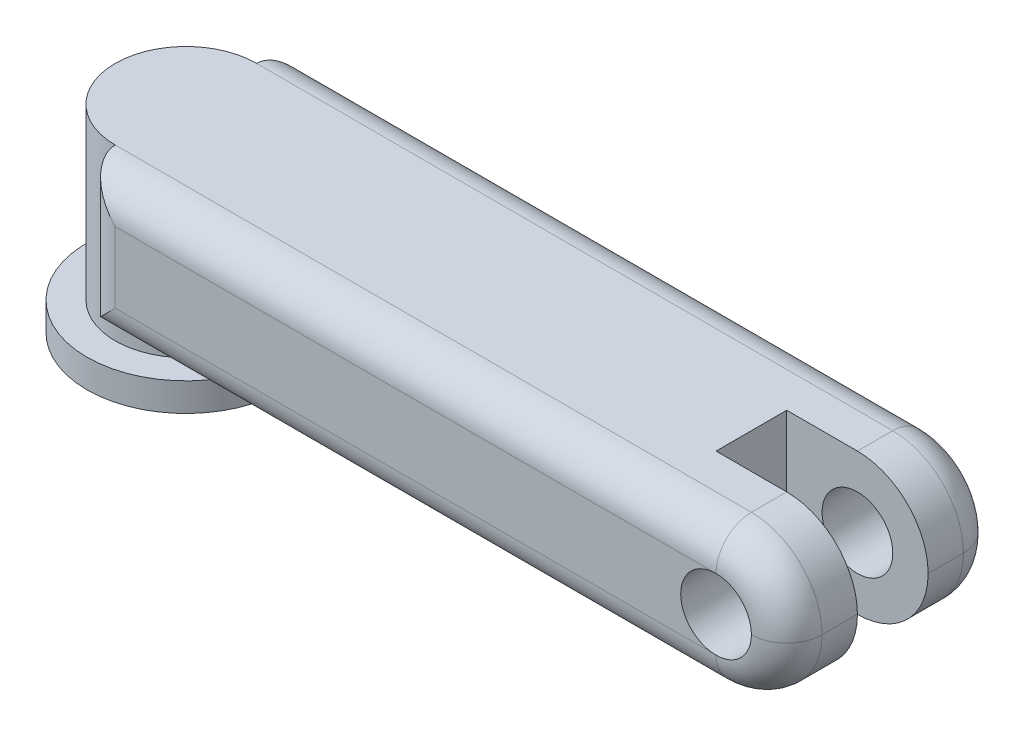
ISO-10303-21;
HEADER;
FILE_DESCRIPTION(('STEP AP214'),'2;1');
FILE_NAME('part.step','',(''),(''),'','','');
FILE_SCHEMA(('AUTOMOTIVE_DESIGN { 1 0 10303 214 1 1 1 1 }'));
ENDSEC;
DATA;
#1=APPLICATION_CONTEXT('core data for automotive mechanical design processes');
#2=APPLICATION_PROTOCOL_DEFINITION('international standard','automotive_design',2000,#1);
#3=PRODUCT_CONTEXT('',#1,'mechanical');
#4=PRODUCT('Part','Part','',(#3));
#5=PRODUCT_RELATED_PRODUCT_CATEGORY('part','',(#4));
#6=PRODUCT_DEFINITION_FORMATION('','',#4);
#7=PRODUCT_DEFINITION_CONTEXT('part definition',#1,'design');
#8=PRODUCT_DEFINITION('design','',#6,#7);
#9=PRODUCT_DEFINITION_SHAPE('','',#8);
#10=(LENGTH_UNIT() NAMED_UNIT(*) SI_UNIT(.MILLI.,.METRE.));
#11=(NAMED_UNIT(*) PLANE_ANGLE_UNIT() SI_UNIT($,.RADIAN.));
#12=(NAMED_UNIT(*) SI_UNIT($,.STERADIAN.) SOLID_ANGLE_UNIT());
#13=UNCERTAINTY_MEASURE_WITH_UNIT(LENGTH_MEASURE(1.E-05),#10,'distance_accuracy_value','');
#14=(GEOMETRIC_REPRESENTATION_CONTEXT(3) GLOBAL_UNCERTAINTY_ASSIGNED_CONTEXT((#13)) GLOBAL_UNIT_ASSIGNED_CONTEXT((#10,
#11,#12)) REPRESENTATION_CONTEXT('',''));
#15=CARTESIAN_POINT('',(0.,0.,0.));
#16=DIRECTION('',(0.,0.,1.));
#17=DIRECTION('',(1.,0.,0.));
#18=AXIS2_PLACEMENT_3D('',#15,#16,#17);
#19=CARTESIAN_POINT('',(40.,10.,-2.5));
#20=DIRECTION('',(0.,0.,1.));
#21=DIRECTION('',(1.,0.,0.));
#22=AXIS2_PLACEMENT_3D('',#19,#20,#21);
#23=PLANE('',#22);
#24=DIRECTION('',(-1.,0.,0.));
#25=VECTOR('',#24,1.);
#26=CARTESIAN_POINT('',(40.,0.,-2.5));
#27=LINE('',#26,#25);
#28=CARTESIAN_POINT('',(45.,0.,-2.5));
#29=VERTEX_POINT('',#28);
#30=CARTESIAN_POINT('',(40.,0.,-2.5));
#31=VERTEX_POINT('',#30);
#32=EDGE_CURVE('E286',#29,#31,#27,.T.);
#33=ORIENTED_EDGE('',*,*,#32,.F.);
#34=CARTESIAN_POINT('',(45.,5.,-2.5));
#35=DIRECTION('',(0.,0.,1.));
#36=DIRECTION('',(1.,0.,0.));
#37=AXIS2_PLACEMENT_3D('',#34,#35,#36);
#38=CIRCLE('',#37,5.);
#39=CARTESIAN_POINT('',(50.,5.,-2.5));
#40=VERTEX_POINT('',#39);
#41=EDGE_CURVE('E247',#29,#40,#38,.T.);
#42=ORIENTED_EDGE('',*,*,#41,.T.);
#43=CARTESIAN_POINT('',(45.,5.,-2.5));
#44=DIRECTION('',(0.,0.,1.));
#45=DIRECTION('',(1.,0.,0.));
#46=AXIS2_PLACEMENT_3D('',#43,#44,#45);
#47=CIRCLE('',#46,5.);
#48=CARTESIAN_POINT('',(45.,10.,-2.5));
#49=VERTEX_POINT('',#48);
#50=EDGE_CURVE('E240',#40,#49,#47,.T.);
#51=ORIENTED_EDGE('',*,*,#50,.T.);
#52=DIRECTION('',(-1.,0.,0.));
#53=VECTOR('',#52,1.);
#54=CARTESIAN_POINT('',(40.,10.,-2.5));
#55=LINE('',#54,#53);
#56=CARTESIAN_POINT('',(40.,10.,-2.5));
#57=VERTEX_POINT('',#56);
#58=EDGE_CURVE('E290',#49,#57,#55,.T.);
#59=ORIENTED_EDGE('',*,*,#58,.T.);
#60=DIRECTION('',(0.,-1.,0.));
#61=VECTOR('',#60,1.);
#62=CARTESIAN_POINT('',(40.,10.,-2.5));
#63=LINE('',#62,#61);
#64=EDGE_CURVE('E299',#57,#31,#63,.T.);
#65=ORIENTED_EDGE('',*,*,#64,.T.);
#66=EDGE_LOOP('',(#33,#42,#51,#59,#65));
#67=FACE_BOUND('',#66,.T.);
#68=CARTESIAN_POINT('',(45.,5.,-2.5));
#69=DIRECTION('',(0.,0.,-1.));
#70=DIRECTION('',(-1.,0.,0.));
#71=AXIS2_PLACEMENT_3D('',#68,#69,#70);
#72=CIRCLE('',#71,2.5);
#73=CARTESIAN_POINT('',(42.5,5.,-2.5));
#74=VERTEX_POINT('',#73);
#75=EDGE_CURVE('E294',#74,#74,#72,.T.);
#76=ORIENTED_EDGE('',*,*,#75,.T.);
#77=EDGE_LOOP('',(#76));
#78=FACE_BOUND('',#77,.T.);
#79=ADVANCED_FACE('F36',(#67,#78),#23,.T.);
#80=CARTESIAN_POINT('',(0.,10.,-7.5));
#81=DIRECTION('',(0.,0.,-1.));
#82=DIRECTION('',(-1.,0.,0.));
#83=AXIS2_PLACEMENT_3D('',#80,#81,#82);
#84=PLANE('',#83);
#85=DIRECTION('',(0.,-1.,0.));
#86=VECTOR('',#85,1.);
#87=CARTESIAN_POINT('',(2.5,10.,-7.5));
#88=LINE('',#87,#86);
#89=CARTESIAN_POINT('',(2.5,2.5,-7.5));
#90=VERTEX_POINT('',#89);
#91=CARTESIAN_POINT('',(2.5,7.5,-7.5));
#92=VERTEX_POINT('',#91);
#93=EDGE_CURVE('E188',#90,#92,#88,.F.);
#94=ORIENTED_EDGE('',*,*,#93,.T.);
#95=DIRECTION('',(1.,0.,0.));
#96=VECTOR('',#95,1.);
#97=CARTESIAN_POINT('',(0.,7.5,-7.5));
#98=LINE('',#97,#96);
#99=CARTESIAN_POINT('',(45.,7.5,-7.5));
#100=VERTEX_POINT('',#99);
#101=EDGE_CURVE('E183',#92,#100,#98,.T.);
#102=ORIENTED_EDGE('',*,*,#101,.T.);
#103=CARTESIAN_POINT('',(45.,5.,-7.5));
#104=DIRECTION('',(0.,0.,-1.));
#105=DIRECTION('',(-1.,0.,0.));
#106=AXIS2_PLACEMENT_3D('',#103,#104,#105);
#107=CIRCLE('',#106,2.5);
#108=CARTESIAN_POINT('',(45.,2.5,-7.5));
#109=VERTEX_POINT('',#108);
#110=EDGE_CURVE('E289',#109,#100,#107,.T.);
#111=ORIENTED_EDGE('',*,*,#110,.F.);
#112=DIRECTION('',(1.,0.,0.));
#113=VECTOR('',#112,1.);
#114=CARTESIAN_POINT('',(0.,2.5,-7.5));
#115=LINE('',#114,#113);
#116=EDGE_CURVE('E258',#109,#90,#115,.F.);
#117=ORIENTED_EDGE('',*,*,#116,.T.);
#118=EDGE_LOOP('',(#94,#102,#111,#117));
#119=FACE_BOUND('',#118,.T.);
#120=ADVANCED_FACE('F266',(#119),#84,.T.);
#121=CARTESIAN_POINT('',(0.,10.,7.5));
#122=DIRECTION('',(0.,0.,-1.));
#123=DIRECTION('',(-1.,0.,0.));
#124=AXIS2_PLACEMENT_3D('',#121,#122,#123);
#125=PLANE('',#124);
#126=CARTESIAN_POINT('',(45.,5.,7.5));
#127=DIRECTION('',(0.,0.,-1.));
#128=DIRECTION('',(-1.,0.,0.));
#129=AXIS2_PLACEMENT_3D('',#126,#127,#128);
#130=CIRCLE('',#129,2.5);
#131=CARTESIAN_POINT('',(45.,2.5,7.5));
#132=VERTEX_POINT('',#131);
#133=CARTESIAN_POINT('',(45.,7.5,7.5));
#134=VERTEX_POINT('',#133);
#135=EDGE_CURVE('E307',#132,#134,#130,.T.);
#136=ORIENTED_EDGE('',*,*,#135,.T.);
#137=DIRECTION('',(1.,0.,0.));
#138=VECTOR('',#137,1.);
#139=CARTESIAN_POINT('',(0.,7.5,7.5));
#140=LINE('',#139,#138);
#141=CARTESIAN_POINT('',(2.5,7.5,7.5));
#142=VERTEX_POINT('',#141);
#143=EDGE_CURVE('E198',#134,#142,#140,.F.);
#144=ORIENTED_EDGE('',*,*,#143,.T.);
#145=DIRECTION('',(0.,-1.,0.));
#146=VECTOR('',#145,1.);
#147=CARTESIAN_POINT('',(2.5,10.,7.5));
#148=LINE('',#147,#146);
#149=CARTESIAN_POINT('',(2.5,2.5,7.5));
#150=VERTEX_POINT('',#149);
#151=EDGE_CURVE('E174',#142,#150,#148,.T.);
#152=ORIENTED_EDGE('',*,*,#151,.T.);
#153=DIRECTION('',(1.,0.,0.));
#154=VECTOR('',#153,1.);
#155=CARTESIAN_POINT('',(0.,2.5,7.5));
#156=LINE('',#155,#154);
#157=EDGE_CURVE('E195',#150,#132,#156,.T.);
#158=ORIENTED_EDGE('',*,*,#157,.T.);
#159=EDGE_LOOP('',(#136,#144,#152,#158));
#160=FACE_BOUND('',#159,.T.);
#161=ADVANCED_FACE('F357',(#160),#125,.F.);
#162=CARTESIAN_POINT('',(40.,10.,2.5));
#163=DIRECTION('',(0.,0.,1.));
#164=DIRECTION('',(1.,0.,0.));
#165=AXIS2_PLACEMENT_3D('',#162,#163,#164);
#166=PLANE('',#165);
#167=CARTESIAN_POINT('',(45.,5.,2.5));
#168=DIRECTION('',(0.,0.,-1.));
#169=DIRECTION('',(-1.,0.,0.));
#170=AXIS2_PLACEMENT_3D('',#167,#168,#169);
#171=CIRCLE('',#170,2.5);
#172=CARTESIAN_POINT('',(42.5,5.,2.5));
#173=VERTEX_POINT('',#172);
#174=EDGE_CURVE('E303',#173,#173,#171,.T.);
#175=ORIENTED_EDGE('',*,*,#174,.F.);
#176=EDGE_LOOP('',(#175));
#177=FACE_BOUND('',#176,.T.);
#178=CARTESIAN_POINT('',(45.,5.,2.5));
#179=DIRECTION('',(0.,0.,1.));
#180=DIRECTION('',(1.,0.,0.));
#181=AXIS2_PLACEMENT_3D('',#178,#179,#180);
#182=CIRCLE('',#181,5.);
#183=CARTESIAN_POINT('',(45.,10.,2.5));
#184=VERTEX_POINT('',#183);
#185=CARTESIAN_POINT('',(50.,5.,2.5));
#186=VERTEX_POINT('',#185);
#187=EDGE_CURVE('E254',#184,#186,#182,.F.);
#188=ORIENTED_EDGE('',*,*,#187,.T.);
#189=CARTESIAN_POINT('',(45.,5.,2.5));
#190=DIRECTION('',(0.,0.,1.));
#191=DIRECTION('',(1.,0.,0.));
#192=AXIS2_PLACEMENT_3D('',#189,#190,#191);
#193=CIRCLE('',#192,5.);
#194=CARTESIAN_POINT('',(45.,0.,2.5));
#195=VERTEX_POINT('',#194);
#196=EDGE_CURVE('E256',#186,#195,#193,.F.);
#197=ORIENTED_EDGE('',*,*,#196,.T.);
#198=DIRECTION('',(-1.,0.,0.));
#199=VECTOR('',#198,1.);
#200=CARTESIAN_POINT('',(40.,0.,2.5));
#201=LINE('',#200,#199);
#202=CARTESIAN_POINT('',(40.,0.,2.5));
#203=VERTEX_POINT('',#202);
#204=EDGE_CURVE('E236',#195,#203,#201,.T.);
#205=ORIENTED_EDGE('',*,*,#204,.T.);
#206=DIRECTION('',(0.,-1.,0.));
#207=VECTOR('',#206,1.);
#208=CARTESIAN_POINT('',(40.,10.,2.5));
#209=LINE('',#208,#207);
#210=CARTESIAN_POINT('',(40.,10.,2.5));
#211=VERTEX_POINT('',#210);
#212=EDGE_CURVE('E242',#211,#203,#209,.T.);
#213=ORIENTED_EDGE('',*,*,#212,.F.);
#214=DIRECTION('',(-1.,0.,0.));
#215=VECTOR('',#214,1.);
#216=CARTESIAN_POINT('',(40.,10.,2.5));
#217=LINE('',#216,#215);
#218=EDGE_CURVE('E310',#184,#211,#217,.T.);
#219=ORIENTED_EDGE('',*,*,#218,.F.);
#220=EDGE_LOOP('',(#188,#197,#205,#213,#219));
#221=FACE_BOUND('',#220,.T.);
#222=ADVANCED_FACE('F334',(#177,#221),#166,.F.);
#223=CARTESIAN_POINT('',(40.,10.,0.));
#224=DIRECTION('',(-1.,0.,0.));
#225=DIRECTION('',(0.,0.,1.));
#226=AXIS2_PLACEMENT_3D('',#223,#224,#225);
#227=PLANE('',#226);
#228=DIRECTION('',(0.,0.,-1.));
#229=VECTOR('',#228,1.);
#230=CARTESIAN_POINT('',(40.,0.,0.));
#231=LINE('',#230,#229);
#232=EDGE_CURVE('E313',#203,#31,#231,.T.);
#233=ORIENTED_EDGE('',*,*,#232,.T.);
#234=ORIENTED_EDGE('',*,*,#64,.F.);
#235=DIRECTION('',(0.,0.,-1.));
#236=VECTOR('',#235,1.);
#237=CARTESIAN_POINT('',(40.,10.,0.));
#238=LINE('',#237,#236);
#239=EDGE_CURVE('E312',#211,#57,#238,.T.);
#240=ORIENTED_EDGE('',*,*,#239,.F.);
#241=ORIENTED_EDGE('',*,*,#212,.T.);
#242=EDGE_LOOP('',(#233,#234,#240,#241));
#243=FACE_BOUND('',#242,.T.);
#244=ADVANCED_FACE('F322',(#243),#227,.F.);
#245=CARTESIAN_POINT('',(0.,10.,0.));
#246=DIRECTION('',(0.,1.,0.));
#247=DIRECTION('',(0.,0.,1.));
#248=AXIS2_PLACEMENT_3D('',#245,#246,#247);
#249=PLANE('',#248);
#250=DIRECTION('',(0.,0.,1.));
#251=VECTOR('',#250,1.);
#252=CARTESIAN_POINT('',(45.,10.,0.));
#253=LINE('',#252,#251);
#254=CARTESIAN_POINT('',(45.,10.,-5.));
#255=VERTEX_POINT('',#254);
#256=EDGE_CURVE('E252',#49,#255,#253,.F.);
#257=ORIENTED_EDGE('',*,*,#256,.T.);
#258=DIRECTION('',(1.,0.,0.));
#259=VECTOR('',#258,1.);
#260=CARTESIAN_POINT('',(0.,10.,-5.));
#261=LINE('',#260,#259);
#262=CARTESIAN_POINT('',(0.,10.,-5.));
#263=VERTEX_POINT('',#262);
#264=EDGE_CURVE('E168',#255,#263,#261,.F.);
#265=ORIENTED_EDGE('',*,*,#264,.T.);
#266=CARTESIAN_POINT('',(0.,10.,0.));
#267=DIRECTION('',(0.,1.,0.));
#268=DIRECTION('',(0.,0.,1.));
#269=AXIS2_PLACEMENT_3D('',#266,#267,#268);
#270=CIRCLE('',#269,5.);
#271=CARTESIAN_POINT('',(0.,10.,5.));
#272=VERTEX_POINT('',#271);
#273=EDGE_CURVE('E151',#263,#272,#270,.T.);
#274=ORIENTED_EDGE('',*,*,#273,.T.);
#275=DIRECTION('',(1.,0.,0.));
#276=VECTOR('',#275,1.);
#277=CARTESIAN_POINT('',(45.,10.,5.));
#278=LINE('',#277,#276);
#279=CARTESIAN_POINT('',(45.,10.,5.));
#280=VERTEX_POINT('',#279);
#281=EDGE_CURVE('E166',#272,#280,#278,.T.);
#282=ORIENTED_EDGE('',*,*,#281,.T.);
#283=DIRECTION('',(0.,0.,-1.));
#284=VECTOR('',#283,1.);
#285=CARTESIAN_POINT('',(45.,10.,2.5));
#286=LINE('',#285,#284);
#287=EDGE_CURVE('E250',#280,#184,#286,.T.);
#288=ORIENTED_EDGE('',*,*,#287,.T.);
#289=ORIENTED_EDGE('',*,*,#218,.T.);
#290=ORIENTED_EDGE('',*,*,#239,.T.);
#291=ORIENTED_EDGE('',*,*,#58,.F.);
#292=EDGE_LOOP('',(#257,#265,#274,#282,#288,#289,#290,#291));
#293=FACE_BOUND('',#292,.T.);
#294=ADVANCED_FACE('F164',(#293),#249,.T.);
#295=CARTESIAN_POINT('',(0.,0.,0.));
#296=DIRECTION('',(0.,1.,0.));
#297=DIRECTION('',(0.,0.,1.));
#298=AXIS2_PLACEMENT_3D('',#295,#296,#297);
#299=PLANE('',#298);
#300=CARTESIAN_POINT('',(0.,0.,0.));
#301=DIRECTION('',(0.,1.,0.));
#302=DIRECTION('',(0.,0.,1.));
#303=AXIS2_PLACEMENT_3D('',#300,#301,#302);
#304=CIRCLE('',#303,5.);
#305=CARTESIAN_POINT('',(0.,0.,5.));
#306=VERTEX_POINT('',#305);
#307=CARTESIAN_POINT('',(0.,0.,-5.));
#308=VERTEX_POINT('',#307);
#309=EDGE_CURVE('E153',#306,#308,#304,.T.);
#310=ORIENTED_EDGE('',*,*,#309,.T.);
#311=DIRECTION('',(1.,0.,0.));
#312=VECTOR('',#311,1.);
#313=CARTESIAN_POINT('',(45.,0.,-5.));
#314=LINE('',#313,#312);
#315=CARTESIAN_POINT('',(45.,0.,-5.));
#316=VERTEX_POINT('',#315);
#317=EDGE_CURVE('E11',#308,#316,#314,.T.);
#318=ORIENTED_EDGE('',*,*,#317,.T.);
#319=DIRECTION('',(0.,0.,1.));
#320=VECTOR('',#319,1.);
#321=CARTESIAN_POINT('',(45.,0.,-2.5));
#322=LINE('',#321,#320);
#323=EDGE_CURVE('E238',#316,#29,#322,.T.);
#324=ORIENTED_EDGE('',*,*,#323,.T.);
#325=ORIENTED_EDGE('',*,*,#32,.T.);
#326=ORIENTED_EDGE('',*,*,#232,.F.);
#327=ORIENTED_EDGE('',*,*,#204,.F.);
#328=DIRECTION('',(0.,0.,-1.));
#329=VECTOR('',#328,1.);
#330=CARTESIAN_POINT('',(45.,0.,0.));
#331=LINE('',#330,#329);
#332=CARTESIAN_POINT('',(45.,0.,5.));
#333=VERTEX_POINT('',#332);
#334=EDGE_CURVE('E234',#195,#333,#331,.F.);
#335=ORIENTED_EDGE('',*,*,#334,.T.);
#336=DIRECTION('',(1.,0.,0.));
#337=VECTOR('',#336,1.);
#338=CARTESIAN_POINT('',(0.,0.,5.));
#339=LINE('',#338,#337);
#340=EDGE_CURVE('E45',#333,#306,#339,.F.);
#341=ORIENTED_EDGE('',*,*,#340,.T.);
#342=EDGE_LOOP('',(#310,#318,#324,#325,#326,#327,#335,#341));
#343=FACE_BOUND('',#342,.T.);
#344=ADVANCED_FACE('F231',(#343),#299,.F.);
#345=CARTESIAN_POINT('',(45.,5.,7.5));
#346=DIRECTION('',(0.,0.,-1.));
#347=DIRECTION('',(-1.,0.,0.));
#348=AXIS2_PLACEMENT_3D('',#345,#346,#347);
#349=CYLINDRICAL_SURFACE('',#348,2.5);
#350=CARTESIAN_POINT('',(47.5,5.,7.5));
#351=VERTEX_POINT('',#350);
#352=EDGE_CURVE('E304',#134,#351,#130,.T.);
#353=ORIENTED_EDGE('',*,*,#352,.F.);
#354=ORIENTED_EDGE('',*,*,#135,.F.);
#355=EDGE_CURVE('E226',#351,#132,#130,.T.);
#356=ORIENTED_EDGE('',*,*,#355,.F.);
#357=EDGE_LOOP('',(#353,#354,#356));
#358=FACE_BOUND('',#357,.T.);
#359=ORIENTED_EDGE('',*,*,#174,.T.);
#360=EDGE_LOOP('',(#359));
#361=FACE_BOUND('',#360,.T.);
#362=ADVANCED_FACE('F361',(#358,#361),#349,.F.);
#363=CARTESIAN_POINT('',(45.,5.,-7.5));
#364=DIRECTION('',(0.,0.,1.));
#365=DIRECTION('',(1.,0.,0.));
#366=AXIS2_PLACEMENT_3D('',#363,#364,#365);
#367=CYLINDRICAL_SURFACE('',#366,2.5);
#368=CARTESIAN_POINT('',(47.5,5.,-7.5));
#369=VERTEX_POINT('',#368);
#370=EDGE_CURVE('E280',#100,#369,#107,.T.);
#371=ORIENTED_EDGE('',*,*,#370,.T.);
#372=EDGE_CURVE('E287',#369,#109,#107,.T.);
#373=ORIENTED_EDGE('',*,*,#372,.T.);
#374=ORIENTED_EDGE('',*,*,#110,.T.);
#375=EDGE_LOOP('',(#371,#373,#374));
#376=FACE_BOUND('',#375,.T.);
#377=ORIENTED_EDGE('',*,*,#75,.F.);
#378=EDGE_LOOP('',(#377));
#379=FACE_BOUND('',#378,.T.);
#380=ADVANCED_FACE('F364',(#376,#379),#367,.F.);
#381=CARTESIAN_POINT('',(0.,-2.,0.));
#382=DIRECTION('',(0.,1.,0.));
#383=DIRECTION('',(0.,0.,1.));
#384=AXIS2_PLACEMENT_3D('',#381,#382,#383);
#385=CYLINDRICAL_SURFACE('',#384,5.);
#386=CARTESIAN_POINT('',(0.,-2.,0.));
#387=DIRECTION('',(0.,-1.,0.));
#388=DIRECTION('',(0.,0.,-1.));
#389=AXIS2_PLACEMENT_3D('',#386,#387,#388);
#390=CIRCLE('',#389,5.);
#391=CARTESIAN_POINT('',(0.,-2.,-5.));
#392=VERTEX_POINT('',#391);
#393=EDGE_CURVE('E169',#392,#392,#390,.F.);
#394=ORIENTED_EDGE('',*,*,#393,.T.);
#395=EDGE_LOOP('',(#394));
#396=FACE_BOUND('',#395,.T.);
#397=DIRECTION('',(0.,1.,0.));
#398=VECTOR('',#397,1.);
#399=CARTESIAN_POINT('',(0.,-2.,-5.));
#400=LINE('',#399,#398);
#401=EDGE_CURVE('E158',#308,#263,#400,.T.);
#402=ORIENTED_EDGE('',*,*,#401,.F.);
#403=ORIENTED_EDGE('',*,*,#309,.F.);
#404=DIRECTION('',(0.,1.,0.));
#405=VECTOR('',#404,1.);
#406=CARTESIAN_POINT('',(0.,-2.,5.));
#407=LINE('',#406,#405);
#408=EDGE_CURVE('E148',#272,#306,#407,.F.);
#409=ORIENTED_EDGE('',*,*,#408,.F.);
#410=ORIENTED_EDGE('',*,*,#273,.F.);
#411=EDGE_LOOP('',(#402,#403,#409,#410));
#412=FACE_BOUND('',#411,.T.);
#413=ADVANCED_FACE('F150',(#396,#412),#385,.T.);
#414=CARTESIAN_POINT('',(0.,-4.,0.));
#415=DIRECTION('',(0.,1.,0.));
#416=DIRECTION('',(0.,0.,1.));
#417=AXIS2_PLACEMENT_3D('',#414,#415,#416);
#418=CYLINDRICAL_SURFACE('',#417,7.);
#419=CARTESIAN_POINT('',(0.,-4.,0.));
#420=DIRECTION('',(0.,-1.,0.));
#421=DIRECTION('',(0.,0.,-1.));
#422=AXIS2_PLACEMENT_3D('',#419,#420,#421);
#423=CIRCLE('',#422,7.);
#424=CARTESIAN_POINT('',(0.,-4.,-7.));
#425=VERTEX_POINT('',#424);
#426=EDGE_CURVE('E411',#425,#425,#423,.T.);
#427=ORIENTED_EDGE('',*,*,#426,.F.);
#428=EDGE_LOOP('',(#427));
#429=FACE_BOUND('',#428,.T.);
#430=CARTESIAN_POINT('',(0.,-2.,0.));
#431=DIRECTION('',(0.,-1.,0.));
#432=DIRECTION('',(0.,0.,-1.));
#433=AXIS2_PLACEMENT_3D('',#430,#431,#432);
#434=CIRCLE('',#433,7.);
#435=CARTESIAN_POINT('',(0.,-2.,-7.));
#436=VERTEX_POINT('',#435);
#437=EDGE_CURVE('E261',#436,#436,#434,.T.);
#438=ORIENTED_EDGE('',*,*,#437,.T.);
#439=EDGE_LOOP('',(#438));
#440=FACE_BOUND('',#439,.T.);
#441=ADVANCED_FACE('F398',(#429,#440),#418,.T.);
#442=CARTESIAN_POINT('',(0.,-4.,0.));
#443=DIRECTION('',(0.,-1.,0.));
#444=DIRECTION('',(0.,0.,-1.));
#445=AXIS2_PLACEMENT_3D('',#442,#443,#444);
#446=PLANE('',#445);
#447=ORIENTED_EDGE('',*,*,#426,.T.);
#448=EDGE_LOOP('',(#447));
#449=FACE_BOUND('',#448,.T.);
#450=ADVANCED_FACE('F386',(#449),#446,.T.);
#451=CARTESIAN_POINT('',(0.,-2.,0.));
#452=DIRECTION('',(0.,-1.,0.));
#453=DIRECTION('',(0.,0.,-1.));
#454=AXIS2_PLACEMENT_3D('',#451,#452,#453);
#455=PLANE('',#454);
#456=ORIENTED_EDGE('',*,*,#393,.F.);
#457=EDGE_LOOP('',(#456));
#458=FACE_BOUND('',#457,.T.);
#459=ORIENTED_EDGE('',*,*,#437,.F.);
#460=EDGE_LOOP('',(#459));
#461=FACE_BOUND('',#460,.T.);
#462=ADVANCED_FACE('F381',(#458,#461),#455,.F.);
#463=CARTESIAN_POINT('',(45.,5.,-7.5));
#464=DIRECTION('',(0.,0.,1.));
#465=DIRECTION('',(1.,0.,0.));
#466=AXIS2_PLACEMENT_3D('',#463,#464,#465);
#467=CYLINDRICAL_SURFACE('',#466,5.);
#468=DIRECTION('',(0.,0.,1.));
#469=VECTOR('',#468,1.);
#470=CARTESIAN_POINT('',(50.,5.,-7.5));
#471=LINE('',#470,#469);
#472=CARTESIAN_POINT('',(50.,5.,-5.));
#473=VERTEX_POINT('',#472);
#474=EDGE_CURVE('E259',#473,#40,#471,.T.);
#475=ORIENTED_EDGE('',*,*,#474,.F.);
#476=CARTESIAN_POINT('',(45.,5.,-5.));
#477=DIRECTION('',(0.,0.,-1.));
#478=DIRECTION('',(-1.,0.,0.));
#479=AXIS2_PLACEMENT_3D('',#476,#477,#478);
#480=CIRCLE('',#479,5.);
#481=EDGE_CURVE('E185',#473,#255,#480,.F.);
#482=ORIENTED_EDGE('',*,*,#481,.T.);
#483=ORIENTED_EDGE('',*,*,#256,.F.);
#484=ORIENTED_EDGE('',*,*,#50,.F.);
#485=EDGE_LOOP('',(#475,#482,#483,#484));
#486=FACE_BOUND('',#485,.T.);
#487=ADVANCED_FACE('F378',(#486),#467,.T.);
#488=CARTESIAN_POINT('',(45.,5.,0.));
#489=DIRECTION('',(0.,0.,-1.));
#490=DIRECTION('',(-1.,0.,0.));
#491=AXIS2_PLACEMENT_3D('',#488,#489,#490);
#492=CYLINDRICAL_SURFACE('',#491,5.);
#493=ORIENTED_EDGE('',*,*,#323,.F.);
#494=CARTESIAN_POINT('',(45.,5.,-5.));
#495=DIRECTION('',(0.,0.,-1.));
#496=DIRECTION('',(-1.,0.,0.));
#497=AXIS2_PLACEMENT_3D('',#494,#495,#496);
#498=CIRCLE('',#497,5.);
#499=EDGE_CURVE('E193',#316,#473,#498,.F.);
#500=ORIENTED_EDGE('',*,*,#499,.T.);
#501=ORIENTED_EDGE('',*,*,#474,.T.);
#502=ORIENTED_EDGE('',*,*,#41,.F.);
#503=EDGE_LOOP('',(#493,#500,#501,#502));
#504=FACE_BOUND('',#503,.T.);
#505=ADVANCED_FACE('F347',(#504),#492,.T.);
#506=CARTESIAN_POINT('',(45.,5.,0.));
#507=DIRECTION('',(0.,0.,1.));
#508=DIRECTION('',(1.,0.,0.));
#509=AXIS2_PLACEMENT_3D('',#506,#507,#508);
#510=CYLINDRICAL_SURFACE('',#509,5.);
#511=ORIENTED_EDGE('',*,*,#287,.F.);
#512=CARTESIAN_POINT('',(45.,5.,5.));
#513=DIRECTION('',(0.,0.,-1.));
#514=DIRECTION('',(-1.,0.,0.));
#515=AXIS2_PLACEMENT_3D('',#512,#513,#514);
#516=CIRCLE('',#515,5.);
#517=CARTESIAN_POINT('',(50.,5.,5.));
#518=VERTEX_POINT('',#517);
#519=EDGE_CURVE('E61',#280,#518,#516,.T.);
#520=ORIENTED_EDGE('',*,*,#519,.T.);
#521=DIRECTION('',(0.,0.,-1.));
#522=VECTOR('',#521,1.);
#523=CARTESIAN_POINT('',(50.,5.,7.5));
#524=LINE('',#523,#522);
#525=EDGE_CURVE('E216',#186,#518,#524,.F.);
#526=ORIENTED_EDGE('',*,*,#525,.F.);
#527=ORIENTED_EDGE('',*,*,#187,.F.);
#528=EDGE_LOOP('',(#511,#520,#526,#527));
#529=FACE_BOUND('',#528,.T.);
#530=ADVANCED_FACE('F335',(#529),#510,.T.);
#531=CARTESIAN_POINT('',(45.,5.,7.5));
#532=DIRECTION('',(0.,0.,-1.));
#533=DIRECTION('',(-1.,0.,0.));
#534=AXIS2_PLACEMENT_3D('',#531,#532,#533);
#535=CYLINDRICAL_SURFACE('',#534,5.);
#536=ORIENTED_EDGE('',*,*,#525,.T.);
#537=CARTESIAN_POINT('',(45.,5.,5.));
#538=DIRECTION('',(0.,0.,-1.));
#539=DIRECTION('',(-1.,0.,0.));
#540=AXIS2_PLACEMENT_3D('',#537,#538,#539);
#541=CIRCLE('',#540,5.);
#542=EDGE_CURVE('E53',#518,#333,#541,.T.);
#543=ORIENTED_EDGE('',*,*,#542,.T.);
#544=ORIENTED_EDGE('',*,*,#334,.F.);
#545=ORIENTED_EDGE('',*,*,#196,.F.);
#546=EDGE_LOOP('',(#536,#543,#544,#545));
#547=FACE_BOUND('',#546,.T.);
#548=ADVANCED_FACE('F336',(#547),#535,.T.);
#549=CARTESIAN_POINT('',(0.,2.5,-5.));
#550=DIRECTION('',(-1.,0.,0.));
#551=DIRECTION('',(0.,0.,1.));
#552=AXIS2_PLACEMENT_3D('',#549,#550,#551);
#553=CYLINDRICAL_SURFACE('',#552,2.5);
#554=CARTESIAN_POINT('',(2.5,2.5,-5.));
#555=DIRECTION('',(-0.707106781186547,0.707106781186547,0.));
#556=DIRECTION('',(-0.707106781186547,-0.707106781186547,0.));
#557=AXIS2_PLACEMENT_3D('',#554,#555,#556);
#558=ELLIPSE('',#557,3.53553390593274,2.5);
#559=EDGE_CURVE('E210',#90,#308,#558,.T.);
#560=ORIENTED_EDGE('',*,*,#559,.F.);
#561=ORIENTED_EDGE('',*,*,#116,.F.);
#562=CARTESIAN_POINT('',(45.,2.5,-5.));
#563=DIRECTION('',(1.,0.,0.));
#564=DIRECTION('',(0.,0.,-1.));
#565=AXIS2_PLACEMENT_3D('',#562,#563,#564);
#566=CIRCLE('',#565,2.5);
#567=EDGE_CURVE('E213',#316,#109,#566,.T.);
#568=ORIENTED_EDGE('',*,*,#567,.F.);
#569=ORIENTED_EDGE('',*,*,#317,.F.);
#570=EDGE_LOOP('',(#560,#561,#568,#569));
#571=FACE_BOUND('',#570,.T.);
#572=ADVANCED_FACE('F338',(#571),#553,.T.);
#573=CARTESIAN_POINT('',(45.,5.,-5.));
#574=DIRECTION('',(0.,0.,-1.));
#575=DIRECTION('',(-1.,0.,0.));
#576=AXIS2_PLACEMENT_3D('',#573,#574,#575);
#577=DEGENERATE_TOROIDAL_SURFACE('',#576,2.5,2.5,.T.);
#578=ORIENTED_EDGE('',*,*,#567,.T.);
#579=ORIENTED_EDGE('',*,*,#372,.F.);
#580=CARTESIAN_POINT('',(47.5,5.,-5.));
#581=DIRECTION('',(0.,1.,0.));
#582=DIRECTION('',(0.,0.,1.));
#583=AXIS2_PLACEMENT_3D('',#580,#581,#582);
#584=CIRCLE('',#583,2.5);
#585=EDGE_CURVE('E207',#473,#369,#584,.T.);
#586=ORIENTED_EDGE('',*,*,#585,.F.);
#587=ORIENTED_EDGE('',*,*,#499,.F.);
#588=EDGE_LOOP('',(#578,#579,#586,#587));
#589=FACE_BOUND('',#588,.T.);
#590=ADVANCED_FACE('F344',(#589),#577,.T.);
#591=CARTESIAN_POINT('',(2.5,10.,-5.));
#592=DIRECTION('',(0.,1.,0.));
#593=DIRECTION('',(0.,0.,1.));
#594=AXIS2_PLACEMENT_3D('',#591,#592,#593);
#595=CYLINDRICAL_SURFACE('',#594,2.5);
#596=ORIENTED_EDGE('',*,*,#559,.T.);
#597=ORIENTED_EDGE('',*,*,#401,.T.);
#598=CARTESIAN_POINT('',(2.5,7.5,-5.));
#599=DIRECTION('',(0.707106781186547,0.707106781186547,0.));
#600=DIRECTION('',(-0.707106781186547,0.707106781186547,0.));
#601=AXIS2_PLACEMENT_3D('',#598,#599,#600);
#602=ELLIPSE('',#601,3.53553390593274,2.5);
#603=EDGE_CURVE('E205',#92,#263,#602,.T.);
#604=ORIENTED_EDGE('',*,*,#603,.F.);
#605=ORIENTED_EDGE('',*,*,#93,.F.);
#606=EDGE_LOOP('',(#596,#597,#604,#605));
#607=FACE_BOUND('',#606,.T.);
#608=ADVANCED_FACE('F273',(#607),#595,.T.);
#609=CARTESIAN_POINT('',(45.,5.,-5.));
#610=DIRECTION('',(0.,0.,-1.));
#611=DIRECTION('',(-1.,0.,0.));
#612=AXIS2_PLACEMENT_3D('',#609,#610,#611);
#613=DEGENERATE_TOROIDAL_SURFACE('',#612,2.5,2.5,.T.);
#614=ORIENTED_EDGE('',*,*,#585,.T.);
#615=ORIENTED_EDGE('',*,*,#370,.F.);
#616=CARTESIAN_POINT('',(45.,7.5,-5.));
#617=DIRECTION('',(-1.,0.,0.));
#618=DIRECTION('',(0.,0.,1.));
#619=AXIS2_PLACEMENT_3D('',#616,#617,#618);
#620=CIRCLE('',#619,2.5);
#621=EDGE_CURVE('E203',#255,#100,#620,.T.);
#622=ORIENTED_EDGE('',*,*,#621,.F.);
#623=ORIENTED_EDGE('',*,*,#481,.F.);
#624=EDGE_LOOP('',(#614,#615,#622,#623));
#625=FACE_BOUND('',#624,.T.);
#626=ADVANCED_FACE('F281',(#625),#613,.T.);
#627=CARTESIAN_POINT('',(0.,7.5,-5.));
#628=DIRECTION('',(1.,0.,0.));
#629=DIRECTION('',(0.,0.,-1.));
#630=AXIS2_PLACEMENT_3D('',#627,#628,#629);
#631=CYLINDRICAL_SURFACE('',#630,2.5);
#632=ORIENTED_EDGE('',*,*,#603,.T.);
#633=ORIENTED_EDGE('',*,*,#264,.F.);
#634=ORIENTED_EDGE('',*,*,#621,.T.);
#635=ORIENTED_EDGE('',*,*,#101,.F.);
#636=EDGE_LOOP('',(#632,#633,#634,#635));
#637=FACE_BOUND('',#636,.T.);
#638=ADVANCED_FACE('F275',(#637),#631,.T.);
#639=CARTESIAN_POINT('',(0.,2.5,5.));
#640=DIRECTION('',(1.,0.,0.));
#641=DIRECTION('',(0.,0.,-1.));
#642=AXIS2_PLACEMENT_3D('',#639,#640,#641);
#643=CYLINDRICAL_SURFACE('',#642,2.5);
#644=CARTESIAN_POINT('',(2.5,2.5,5.));
#645=DIRECTION('',(0.707106781186547,-0.707106781186547,0.));
#646=DIRECTION('',(0.707106781186547,0.707106781186547,0.));
#647=AXIS2_PLACEMENT_3D('',#644,#645,#646);
#648=ELLIPSE('',#647,3.53553390593274,2.5);
#649=EDGE_CURVE('E219',#306,#150,#648,.F.);
#650=ORIENTED_EDGE('',*,*,#649,.F.);
#651=ORIENTED_EDGE('',*,*,#340,.F.);
#652=CARTESIAN_POINT('',(45.,2.5,5.));
#653=DIRECTION('',(1.,0.,0.));
#654=DIRECTION('',(0.,0.,-1.));
#655=AXIS2_PLACEMENT_3D('',#652,#653,#654);
#656=CIRCLE('',#655,2.5);
#657=EDGE_CURVE('E40',#132,#333,#656,.T.);
#658=ORIENTED_EDGE('',*,*,#657,.F.);
#659=ORIENTED_EDGE('',*,*,#157,.F.);
#660=EDGE_LOOP('',(#650,#651,#658,#659));
#661=FACE_BOUND('',#660,.T.);
#662=ADVANCED_FACE('F38',(#661),#643,.T.);
#663=CARTESIAN_POINT('',(45.,5.,5.));
#664=DIRECTION('',(0.,0.,-1.));
#665=DIRECTION('',(-1.,0.,0.));
#666=AXIS2_PLACEMENT_3D('',#663,#664,#665);
#667=DEGENERATE_TOROIDAL_SURFACE('',#666,2.5,2.5,.T.);
#668=ORIENTED_EDGE('',*,*,#657,.T.);
#669=ORIENTED_EDGE('',*,*,#542,.F.);
#670=CARTESIAN_POINT('',(47.5,5.,5.));
#671=DIRECTION('',(0.,1.,0.));
#672=DIRECTION('',(0.,0.,1.));
#673=AXIS2_PLACEMENT_3D('',#670,#671,#672);
#674=CIRCLE('',#673,2.5);
#675=EDGE_CURVE('E178',#351,#518,#674,.T.);
#676=ORIENTED_EDGE('',*,*,#675,.F.);
#677=ORIENTED_EDGE('',*,*,#355,.T.);
#678=EDGE_LOOP('',(#668,#669,#676,#677));
#679=FACE_BOUND('',#678,.T.);
#680=ADVANCED_FACE('F224',(#679),#667,.T.);
#681=CARTESIAN_POINT('',(2.5,10.,5.));
#682=DIRECTION('',(0.,-1.,0.));
#683=DIRECTION('',(0.,0.,-1.));
#684=AXIS2_PLACEMENT_3D('',#681,#682,#683);
#685=CYLINDRICAL_SURFACE('',#684,2.5);
#686=ORIENTED_EDGE('',*,*,#649,.T.);
#687=ORIENTED_EDGE('',*,*,#151,.F.);
#688=CARTESIAN_POINT('',(2.5,7.5,5.));
#689=DIRECTION('',(-0.707106781186547,-0.707106781186547,0.));
#690=DIRECTION('',(0.707106781186547,-0.707106781186547,0.));
#691=AXIS2_PLACEMENT_3D('',#688,#689,#690);
#692=ELLIPSE('',#691,3.53553390593274,2.5);
#693=EDGE_CURVE('E172',#272,#142,#692,.F.);
#694=ORIENTED_EDGE('',*,*,#693,.F.);
#695=ORIENTED_EDGE('',*,*,#408,.T.);
#696=EDGE_LOOP('',(#686,#687,#694,#695));
#697=FACE_BOUND('',#696,.T.);
#698=ADVANCED_FACE('F173',(#697),#685,.T.);
#699=CARTESIAN_POINT('',(45.,5.,5.));
#700=DIRECTION('',(0.,0.,-1.));
#701=DIRECTION('',(-1.,0.,0.));
#702=AXIS2_PLACEMENT_3D('',#699,#700,#701);
#703=DEGENERATE_TOROIDAL_SURFACE('',#702,2.5,2.5,.T.);
#704=ORIENTED_EDGE('',*,*,#675,.T.);
#705=ORIENTED_EDGE('',*,*,#519,.F.);
#706=CARTESIAN_POINT('',(45.,7.5,5.));
#707=DIRECTION('',(-1.,0.,0.));
#708=DIRECTION('',(0.,0.,1.));
#709=AXIS2_PLACEMENT_3D('',#706,#707,#708);
#710=CIRCLE('',#709,2.5);
#711=EDGE_CURVE('E179',#134,#280,#710,.T.);
#712=ORIENTED_EDGE('',*,*,#711,.F.);
#713=ORIENTED_EDGE('',*,*,#352,.T.);
#714=EDGE_LOOP('',(#704,#705,#712,#713));
#715=FACE_BOUND('',#714,.T.);
#716=ADVANCED_FACE('F510',(#715),#703,.T.);
#717=CARTESIAN_POINT('',(0.,7.5,5.));
#718=DIRECTION('',(-1.,0.,0.));
#719=DIRECTION('',(0.,0.,1.));
#720=AXIS2_PLACEMENT_3D('',#717,#718,#719);
#721=CYLINDRICAL_SURFACE('',#720,2.5);
#722=ORIENTED_EDGE('',*,*,#693,.T.);
#723=ORIENTED_EDGE('',*,*,#143,.F.);
#724=ORIENTED_EDGE('',*,*,#711,.T.);
#725=ORIENTED_EDGE('',*,*,#281,.F.);
#726=EDGE_LOOP('',(#722,#723,#724,#725));
#727=FACE_BOUND('',#726,.T.);
#728=ADVANCED_FACE('F181',(#727),#721,.T.);
#729=CLOSED_SHELL('',(#79,#120,#161,#222,#244,#294,#344,#362,#380,#413,#441,#450,#462,#487,#505,
#530,#548,#572,#590,#608,#626,#638,#662,#680,#698,#716,#728));
#730=MANIFOLD_SOLID_BREP('B2',#729);
#731=ADVANCED_BREP_SHAPE_REPRESENTATION('',(#18,#730),#14);
#732=SHAPE_DEFINITION_REPRESENTATION(#9,#731);
ENDSEC;
END-ISO-10303-21;
